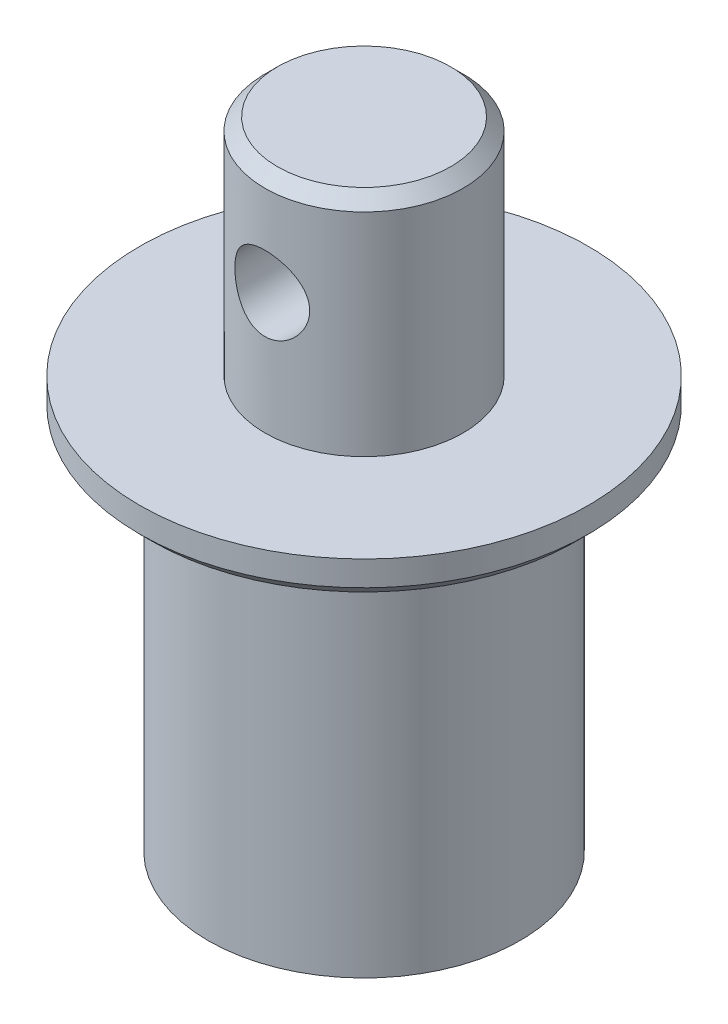
ISO-10303-21;
HEADER;
FILE_DESCRIPTION(('STEP AP214'),'2;1');
FILE_NAME('part.step','',(''),(''),'','','');
FILE_SCHEMA(('AUTOMOTIVE_DESIGN { 1 0 10303 214 1 1 1 1 }'));
ENDSEC;
DATA;
#1=APPLICATION_CONTEXT('core data for automotive mechanical design processes');
#2=APPLICATION_PROTOCOL_DEFINITION('international standard','automotive_design',2000,#1);
#3=PRODUCT_CONTEXT('',#1,'mechanical');
#4=PRODUCT('Part','Part','',(#3));
#5=PRODUCT_RELATED_PRODUCT_CATEGORY('part','',(#4));
#6=PRODUCT_DEFINITION_FORMATION('','',#4);
#7=PRODUCT_DEFINITION_CONTEXT('part definition',#1,'design');
#8=PRODUCT_DEFINITION('design','',#6,#7);
#9=PRODUCT_DEFINITION_SHAPE('','',#8);
#10=(LENGTH_UNIT() NAMED_UNIT(*) SI_UNIT(.MILLI.,.METRE.));
#11=(NAMED_UNIT(*) PLANE_ANGLE_UNIT() SI_UNIT($,.RADIAN.));
#12=(NAMED_UNIT(*) SI_UNIT($,.STERADIAN.) SOLID_ANGLE_UNIT());
#13=UNCERTAINTY_MEASURE_WITH_UNIT(LENGTH_MEASURE(1.E-05),#10,'distance_accuracy_value','');
#14=(GEOMETRIC_REPRESENTATION_CONTEXT(3) GLOBAL_UNCERTAINTY_ASSIGNED_CONTEXT((#13)) GLOBAL_UNIT_ASSIGNED_CONTEXT((#10,
#11,#12)) REPRESENTATION_CONTEXT('',''));
#15=CARTESIAN_POINT('',(0.,0.,0.));
#16=DIRECTION('',(0.,0.,1.));
#17=DIRECTION('',(1.,0.,0.));
#18=AXIS2_PLACEMENT_3D('',#15,#16,#17);
#19=CARTESIAN_POINT('',(0.,18.,0.));
#20=DIRECTION('',(0.,-1.,0.));
#21=DIRECTION('',(0.,0.,-1.));
#22=AXIS2_PLACEMENT_3D('',#19,#20,#21);
#23=CYLINDRICAL_SURFACE('',#22,7.95);
#24=CARTESIAN_POINT('',(0.,12.7,-7.95));
#25=CARTESIAN_POINT('',(-0.162397491346748,12.7000061558222,-7.95000463305476));
#26=CARTESIAN_POINT('',(-0.324753099848184,12.686772434708,-7.94498084128038));
#27=CARTESIAN_POINT('',(-0.644608276496746,12.6344046885734,-7.92544254710234));
#28=CARTESIAN_POINT('',(-0.802108607238702,12.5952747528614,-7.91092954315817));
#29=CARTESIAN_POINT('',(-1.10759384707584,12.4926982224202,-7.87396945860854));
#30=CARTESIAN_POINT('',(-1.25559660387506,12.4292988958457,-7.85153780728387));
#31=CARTESIAN_POINT('',(-1.53885384506537,12.2802252539554,-7.80097147100144));
#32=CARTESIAN_POINT('',(-1.67410485143574,12.1945448853293,-7.77283523668182));
#33=CARTESIAN_POINT('',(-1.93382546780257,11.9995011008524,-7.71241146666441));
#34=CARTESIAN_POINT('',(-2.05767538384719,11.8893495621118,-7.68000542519286));
#35=CARTESIAN_POINT('',(-2.28564512635348,11.6501633262448,-7.61527381268037));
#36=CARTESIAN_POINT('',(-2.38975880250598,11.5211227649516,-7.58294826981162));
#37=CARTESIAN_POINT('',(-2.57926636225751,11.2417374560993,-7.52065411531348));
#38=CARTESIAN_POINT('',(-2.6637805831916,11.0907618050901,-7.49082499932832));
#39=CARTESIAN_POINT('',(-2.80594178602416,10.7754371382371,-7.43874757327125));
#40=CARTESIAN_POINT('',(-2.86359965340992,10.611093572494,-7.41649619275682));
#41=CARTESIAN_POINT('',(-2.94795796885627,10.2808348690774,-7.38336190811873));
#42=CARTESIAN_POINT('',(-2.97584212262488,10.115266990026,-7.37204616258461));
#43=CARTESIAN_POINT('',(-3.00356228598173,9.7814451398545,-7.36079887492185));
#44=CARTESIAN_POINT('',(-3.00341006762254,9.61319232577162,-7.36086255474267));
#45=CARTESIAN_POINT('',(-2.97596618835097,9.28965599589298,-7.37199408836324));
#46=CARTESIAN_POINT('',(-2.950323119074,9.13420535263497,-7.38239348387374));
#47=CARTESIAN_POINT('',(-2.87535300460385,8.83000298266155,-7.41191277552078));
#48=CARTESIAN_POINT('',(-2.8260223465669,8.68125228161165,-7.43103400189338));
#49=CARTESIAN_POINT('',(-2.70418189216197,8.39133492929746,-7.47624078591974));
#50=CARTESIAN_POINT('',(-2.6312480533409,8.2503669739539,-7.50245218680417));
#51=CARTESIAN_POINT('',(-2.46456734066459,7.98219471048518,-7.55884475137268));
#52=CARTESIAN_POINT('',(-2.3708132173386,7.8549952194409,-7.58902729628462));
#53=CARTESIAN_POINT('',(-2.15763402761747,7.60885443691731,-7.65246921492573));
#54=CARTESIAN_POINT('',(-2.03689525756286,7.49106604037545,-7.68579812115875));
#55=CARTESIAN_POINT('',(-1.77699753283556,7.27706373431274,-7.75001160096118));
#56=CARTESIAN_POINT('',(-1.63783568074396,7.18085322479597,-7.78089578882361));
#57=CARTESIAN_POINT('',(-1.34207116187379,7.01144460931163,-7.8373678710877));
#58=CARTESIAN_POINT('',(-1.18522721144044,6.93863503487575,-7.86286415320891));
#59=CARTESIAN_POINT('',(-0.86031470200094,6.82081904211372,-7.90500692503182));
#60=CARTESIAN_POINT('',(-0.692251231753698,6.77580011265377,-7.92165739657785));
#61=CARTESIAN_POINT('',(-0.359369733398546,6.71707032438193,-7.94353018166807));
#62=CARTESIAN_POINT('',(-0.19486250407749,6.70180726332692,-7.94931845634064));
#63=CARTESIAN_POINT('',(0.134445660228267,6.69849692676496,-7.95056675753456));
#64=CARTESIAN_POINT('',(0.299246520773491,6.71044352644258,-7.94602910839152));
#65=CARTESIAN_POINT('',(0.617726140759181,6.76003703811891,-7.92750856979343));
#66=CARTESIAN_POINT('',(0.771587980773982,6.79666317138276,-7.91390105530444));
#67=CARTESIAN_POINT('',(1.07087124221814,6.89322789669408,-7.87898797802321));
#68=CARTESIAN_POINT('',(1.21629156356081,6.95316951937971,-7.85768141450416));
#69=CARTESIAN_POINT('',(1.49937620417867,7.09658093164373,-7.8086891601555));
#70=CARTESIAN_POINT('',(1.63668485220481,7.18069302598826,-7.78083372768987));
#71=CARTESIAN_POINT('',(1.89570132393103,7.36933296202654,-7.7218192041405));
#72=CARTESIAN_POINT('',(2.01740330922294,7.47386840734707,-7.6906588846264));
#73=CARTESIAN_POINT('',(2.24923419609776,7.70761385915857,-7.62618977395529));
#74=CARTESIAN_POINT('',(2.35826281750802,7.83791282891418,-7.59286232939511));
#75=CARTESIAN_POINT('',(2.55312943709526,8.1156069199928,-7.52957881379437));
#76=CARTESIAN_POINT('',(2.63896520992051,8.26300367990923,-7.49962306642862));
#77=CARTESIAN_POINT('',(2.78513438407435,8.57201209893149,-7.44658528316189));
#78=CARTESIAN_POINT('',(2.84534845350868,8.733686127761,-7.42353555585956));
#79=CARTESIAN_POINT('',(2.93729581964043,9.06599351023611,-7.38764350420071));
#80=CARTESIAN_POINT('',(2.96904704082561,9.23662115356447,-7.374794756358));
#81=CARTESIAN_POINT('',(3.00155503802499,9.57005302179686,-7.36161978142478));
#82=CARTESIAN_POINT('',(3.00419110375903,9.73264550820018,-7.36053436127972));
#83=CARTESIAN_POINT('',(2.98321973734044,10.0558276842463,-7.36905868877781));
#84=CARTESIAN_POINT('',(2.95961485946022,10.2164175672823,-7.37866739546335));
#85=CARTESIAN_POINT('',(2.88830176573362,10.5259293606051,-7.40686184253781));
#86=CARTESIAN_POINT('',(2.84137107510192,10.6750591479437,-7.42515720122094));
#87=CARTESIAN_POINT('',(2.72542723369112,10.963412785519,-7.46849099490141));
#88=CARTESIAN_POINT('',(2.65640846747208,11.1026341057172,-7.49353114436682));
#89=CARTESIAN_POINT('',(2.4940127469099,11.375226883347,-7.54918066261999));
#90=CARTESIAN_POINT('',(2.39954048534419,11.5078994030905,-7.58001455370614));
#91=CARTESIAN_POINT('',(2.19060617827199,11.7561080525092,-7.64301253026733));
#92=CARTESIAN_POINT('',(2.07613773887328,11.8716386790474,-7.67517703869663));
#93=CARTESIAN_POINT('',(1.82292686694646,12.0887750295145,-7.73934015838431));
#94=CARTESIAN_POINT('',(1.68319475235042,12.1892633965218,-7.7712320684291));
#95=CARTESIAN_POINT('',(1.38770505428977,12.365304905216,-7.82939530273651));
#96=CARTESIAN_POINT('',(1.23194587961074,12.4408555678737,-7.85566606811619));
#97=CARTESIAN_POINT('',(0.900729443719499,12.5673316594021,-7.90065816243918));
#98=CARTESIAN_POINT('',(0.72468257870646,12.6168806341044,-7.91895015266806));
#99=CARTESIAN_POINT('',(0.36573704474032,12.6832028472176,-7.94361537532247));
#100=CARTESIAN_POINT('',(0.182841976353428,12.6999930692113,-7.94999478368242));
#101=CARTESIAN_POINT('',(0.,12.7,-7.95));
#102=B_SPLINE_CURVE_WITH_KNOTS('',3,(#24,#25,#26,#27,#28,#29,#30,#31,#32,#33,#34,#35,#36,#37,
#38,#39,#40,#41,#42,#43,#44,#45,#46,#47,#48,#49,#50,#51,#52,#53,#54,#55,#56,#57,#58,#59,#60,#61,
#62,#63,#64,#65,#66,#67,#68,#69,#70,#71,#72,#73,#74,#75,#76,#77,#78,#79,#80,#81,#82,#83,#84,#85,
#86,#87,#88,#89,#90,#91,#92,#93,#94,#95,#96,#97,#98,#99,#100,#101),.UNSPECIFIED.,.T.,.F.,(4,2,2,
2,2,2,2,2,2,2,2,2,2,2,2,2,2,2,2,2,2,2,2,2,2,2,2,2,2,2,2,2,2,2,2,2,2,2,4),(0.,0.486517984474757,
0.972959160520783,1.45845770295972,1.94408828362444,2.44851024997547,2.95308914942897,
3.47718162143792,4.00106148167018,4.50323487057201,5.00519740487303,5.47667849204093,
5.94823151260985,6.42877607760176,6.90948822777715,7.42294833461538,7.93648929004924,
8.45816227693261,8.97960023906363,9.4730216283662,9.96633196092749,10.4403977118492,
10.9145251042877,11.4026484582173,11.8909538882842,12.4079529144854,12.9250015290952,
13.4444325927827,13.9635363143255,14.4489214843418,14.9342594114916,15.4044069203738,
15.8746740496895,16.36981560475,16.8651157749309,17.3876947690209,17.9103256964684,
18.4583764326353,19.0061429595389),.UNSPECIFIED.);
#103=CARTESIAN_POINT('',(0.,12.7,-7.95));
#104=VERTEX_POINT('',#103);
#105=EDGE_CURVE('E38',#104,#104,#102,.T.);
#106=ORIENTED_EDGE('',*,*,#105,.T.);
#107=EDGE_LOOP('',(#106));
#108=FACE_BOUND('',#107,.T.);
#109=CARTESIAN_POINT('',(3.,9.7,7.36223471508482));
#110=CARTESIAN_POINT('',(2.99998847638603,9.53818087912798,7.36224526269351));
#111=CARTESIAN_POINT('',(2.9868408533845,9.3762103722872,7.36763957602915));
#112=CARTESIAN_POINT('',(2.93479898105657,9.05725888996367,7.38851783959744));
#113=CARTESIAN_POINT('',(2.89590575612689,8.90027771621983,7.40400138838714));
#114=CARTESIAN_POINT('',(2.79402781177854,8.59586930724842,7.44304061076884));
#115=CARTESIAN_POINT('',(2.731101471071,8.44841992534473,7.46657670963436));
#116=CARTESIAN_POINT('',(2.58314510981222,8.16612081406447,7.51904250584225));
#117=CARTESIAN_POINT('',(2.49810836153358,8.03127493667398,7.54797384408236));
#118=CARTESIAN_POINT('',(2.30376153242717,7.77121232087998,7.60960064181843));
#119=CARTESIAN_POINT('',(2.19351841745457,7.64671904452181,7.64240778971228));
#120=CARTESIAN_POINT('',(1.95386685111475,7.41747705800545,7.70715883050975));
#121=CARTESIAN_POINT('',(1.82445425584252,7.31273262815022,7.73910253499114));
#122=CARTESIAN_POINT('',(1.5446329927432,7.12246295020474,7.79985728918744));
#123=CARTESIAN_POINT('',(1.3936537720354,7.03772592201908,7.82852214322748));
#124=CARTESIAN_POINT('',(1.07830992462711,6.89515458942065,7.87814508841391));
#125=CARTESIAN_POINT('',(0.913950027301735,6.83731082772747,7.89910588822244));
#126=CARTESIAN_POINT('',(0.584118525776006,6.75271083408455,7.93016590252776));
#127=CARTESIAN_POINT('',(0.419008191449069,6.72470854121812,7.9406990457691));
#128=CARTESIAN_POINT('',(0.0861182550130894,6.69659199426228,7.9512752587645));
#129=CARTESIAN_POINT('',(-0.0816604499755095,6.69646855740847,7.95132178261133));
#130=CARTESIAN_POINT('',(-0.406186165059413,6.7233915100908,7.94119442034515));
#131=CARTESIAN_POINT('',(-0.563064807507878,6.74907733331319,7.93153233504782));
#132=CARTESIAN_POINT('',(-0.870095460195534,6.82459864135385,7.90374636952053));
#133=CARTESIAN_POINT('',(-1.02024699260719,6.87443583868587,7.88562188924655));
#134=CARTESIAN_POINT('',(-1.31216781002694,6.9974680388243,7.84237373573117));
#135=CARTESIAN_POINT('',(-1.45378254871369,7.07099371538483,7.81715165701678));
#136=CARTESIAN_POINT('',(-1.72301698371786,7.23902153583117,7.76225605799518));
#137=CARTESIAN_POINT('',(-1.85063211474019,7.33353049219717,7.73258109302015));
#138=CARTESIAN_POINT('',(-2.09625291168491,7.54737826155229,7.66976135047149));
#139=CARTESIAN_POINT('',(-2.2132430127343,7.66785547278632,7.63651515908535));
#140=CARTESIAN_POINT('',(-2.42574456827632,7.92691204717986,7.57169953695764));
#141=CARTESIAN_POINT('',(-2.52125048739725,8.06549606102768,7.54013053993966));
#142=CARTESIAN_POINT('',(-2.69004722792075,8.36088829744311,7.48159976832992));
#143=CARTESIAN_POINT('',(-2.76278393320141,8.51803907720284,7.45475898596922));
#144=CARTESIAN_POINT('',(-2.880375100483,8.84363902404656,7.41012433225883));
#145=CARTESIAN_POINT('',(-2.92524531348823,9.0120817488069,7.39232535124068));
#146=CARTESIAN_POINT('',(-2.98350497294114,9.34543862821912,7.36899818161272));
#147=CARTESIAN_POINT('',(-2.99850974291805,9.51002612552786,7.36284132147711));
#148=CARTESIAN_POINT('',(-3.00127750176349,9.83944639008965,7.36171480133552));
#149=CARTESIAN_POINT('',(-2.98904742268387,10.0042790842612,7.36674229458981));
#150=CARTESIAN_POINT('',(-2.93915784101862,10.3211629550074,7.38677890427645));
#151=CARTESIAN_POINT('',(-2.90275536170076,10.4734469127311,7.40129408111521));
#152=CARTESIAN_POINT('',(-2.80714040331809,10.7696728223296,7.43808226609779));
#153=CARTESIAN_POINT('',(-2.74792321527995,10.9136130449902,7.46035687570344));
#154=CARTESIAN_POINT('',(-2.60584361626127,11.1951164240263,7.51118902933162));
#155=CARTESIAN_POINT('',(-2.5221722334124,11.3322330449096,7.53995219207521));
#156=CARTESIAN_POINT('',(-2.33441687648243,11.5910526702668,7.60017799915619));
#157=CARTESIAN_POINT('',(-2.2303253503514,11.7127499446626,7.63164163979143));
#158=CARTESIAN_POINT('',(-1.99676156560833,11.9453999274485,7.69616935064396));
#159=CARTESIAN_POINT('',(-1.86608723424952,12.055157597863,7.72920614910852));
#160=CARTESIAN_POINT('',(-1.5873664361605,12.2513337907439,7.79122096312534));
#161=CARTESIAN_POINT('',(-1.43931986006059,12.3377521662627,7.82019895312222));
#162=CARTESIAN_POINT('',(-1.13009967886562,12.4842477994431,7.87082025135715));
#163=CARTESIAN_POINT('',(-0.968969651016516,12.5444085640794,7.89248676165433));
#164=CARTESIAN_POINT('',(-0.637870931627841,12.6364273074365,7.9261118932038));
#165=CARTESIAN_POINT('',(-0.467906493780563,12.6682987760011,7.9380751412537));
#166=CARTESIAN_POINT('',(-0.134758318572021,12.7013659427001,7.95050234819133));
#167=CARTESIAN_POINT('',(0.0282347182748412,12.7042587720064,7.95160244842512));
#168=CARTESIAN_POINT('',(0.352286714056232,12.6836626905325,7.94384354853882));
#169=CARTESIAN_POINT('',(0.513345908784079,12.6601770297837,7.93498577530464));
#170=CARTESIAN_POINT('',(0.824872903926982,12.5886848977638,7.90859918182994));
#171=CARTESIAN_POINT('',(0.975504704927181,12.5413048913794,7.89129223621013));
#172=CARTESIAN_POINT('',(1.26668938334082,12.4239952510697,7.84981845145297));
#173=CARTESIAN_POINT('',(1.407240345928,12.3540613468895,7.82565031335174));
#174=CARTESIAN_POINT('',(1.68078304743255,12.1902710199168,7.77159770902848));
#175=CARTESIAN_POINT('',(1.81320405662409,12.0955282806332,7.74151478259925));
#176=CARTESIAN_POINT('',(2.06079145832988,11.886191784806,7.67932043381079));
#177=CARTESIAN_POINT('',(2.17595163342778,11.7715909071818,7.64720828641126));
#178=CARTESIAN_POINT('',(2.39209703979936,11.5185257698201,7.58246561904029));
#179=CARTESIAN_POINT('',(2.49199147751535,11.3791116040763,7.54989958951667));
#180=CARTESIAN_POINT('',(2.66701047282742,11.0843339824656,7.48987098387787));
#181=CARTESIAN_POINT('',(2.74213185351583,10.9289684843405,7.46240906251267));
#182=CARTESIAN_POINT('',(2.83572851156726,10.6832960070156,7.427133469645));
#183=CARTESIAN_POINT('',(2.86416654860317,10.5971118170317,7.41618073356408));
#184=CARTESIAN_POINT('',(2.91317517775546,10.4222468796589,7.39706747795765));
#185=CARTESIAN_POINT('',(2.93374932570495,10.3335672801464,7.38890569661591));
#186=CARTESIAN_POINT('',(2.96676758310502,10.1545045054933,7.37571079709818));
#187=CARTESIAN_POINT('',(2.97921437058769,10.0641219016166,7.37067664836809));
#188=CARTESIAN_POINT('',(2.99583331277785,9.88250884982683,7.36393584017285));
#189=CARTESIAN_POINT('',(3.00000650021022,9.79127850915807,7.36222876541712));
#190=CARTESIAN_POINT('',(3.,9.7,7.36223471508482));
#191=B_SPLINE_CURVE_WITH_KNOTS('',3,(#109,#110,#111,#112,#113,#114,#115,#116,#117,#118,#119,
#120,#121,#122,#123,#124,#125,#126,#127,#128,#129,#130,#131,#132,#133,#134,#135,#136,#137,#138,
#139,#140,#141,#142,#143,#144,#145,#146,#147,#148,#149,#150,#151,#152,#153,#154,#155,#156,#157,
#158,#159,#160,#161,#162,#163,#164,#165,#166,#167,#168,#169,#170,#171,#172,#173,#174,#175,#176,
#177,#178,#179,#180,#181,#182,#183,#184,#185,#186,#187,#188,#189,#190),.UNSPECIFIED.,.T.,.F.,(4,
2,2,2,2,2,2,2,2,2,2,2,2,2,2,2,2,2,2,2,2,2,2,2,2,2,2,2,2,2,2,2,2,2,2,2,2,2,2,2,4),(0.,
0.485113019094003,0.97020673709227,1.45412953481374,1.93819975263346,2.44443134249792,
2.95077252559746,3.47459178516768,3.99822669897873,4.49901899995725,4.99964634924538,
5.47519839146572,5.95078415883133,6.43331940839045,6.91601154864105,7.42726811632732,
7.93865625811923,8.46166485432304,8.98437756017793,9.47795435847515,9.97140554165079,
10.4410183842214,10.9107282072142,11.3981880218201,11.885828456347,12.4048427572537,
12.9238603258718,13.4412150191416,13.9583228773832,14.444955850278,14.9315288728514,
15.4059609368032,15.8804828804031,16.3750646117023,16.8698240672408,17.3911057262614,
17.9124542086976,18.1863439084664,18.4601096159644,18.7337850698281,19.0074263609033),.UNSPECIFIED.);
#192=CARTESIAN_POINT('',(3.,9.7,7.36223471508482));
#193=VERTEX_POINT('',#192);
#194=EDGE_CURVE('E71',#193,#193,#191,.T.);
#195=ORIENTED_EDGE('',*,*,#194,.T.);
#196=EDGE_LOOP('',(#195));
#197=FACE_BOUND('',#196,.T.);
#198=CARTESIAN_POINT('',(0.,17.,0.));
#199=DIRECTION('',(0.,1.,0.));
#200=DIRECTION('',(0.,0.,1.));
#201=AXIS2_PLACEMENT_3D('',#198,#199,#200);
#202=CIRCLE('',#201,7.95);
#203=CARTESIAN_POINT('',(0.,17.,7.95));
#204=VERTEX_POINT('',#203);
#205=EDGE_CURVE('E67',#204,#204,#202,.F.);
#206=ORIENTED_EDGE('',*,*,#205,.T.);
#207=EDGE_LOOP('',(#206));
#208=FACE_BOUND('',#207,.T.);
#209=CARTESIAN_POINT('',(0.,0.,0.));
#210=DIRECTION('',(0.,1.,0.));
#211=DIRECTION('',(0.,0.,1.));
#212=AXIS2_PLACEMENT_3D('',#209,#210,#211);
#213=CIRCLE('',#212,7.95);
#214=CARTESIAN_POINT('',(0.,0.,7.95));
#215=VERTEX_POINT('',#214);
#216=EDGE_CURVE('E61',#215,#215,#213,.T.);
#217=ORIENTED_EDGE('',*,*,#216,.T.);
#218=EDGE_LOOP('',(#217));
#219=FACE_BOUND('',#218,.T.);
#220=ADVANCED_FACE('F33',(#108,#197,#208,#219),#23,.T.);
#221=CARTESIAN_POINT('',(0.,18.,0.));
#222=DIRECTION('',(0.,1.,0.));
#223=DIRECTION('',(0.,0.,1.));
#224=AXIS2_PLACEMENT_3D('',#221,#222,#223);
#225=PLANE('',#224);
#226=CARTESIAN_POINT('',(0.,18.,0.));
#227=DIRECTION('',(0.,1.,0.));
#228=DIRECTION('',(0.,0.,1.));
#229=AXIS2_PLACEMENT_3D('',#226,#227,#228);
#230=CIRCLE('',#229,6.95);
#231=CARTESIAN_POINT('',(0.,18.,6.95));
#232=VERTEX_POINT('',#231);
#233=EDGE_CURVE('E64',#232,#232,#230,.T.);
#234=ORIENTED_EDGE('',*,*,#233,.T.);
#235=EDGE_LOOP('',(#234));
#236=FACE_BOUND('',#235,.T.);
#237=ADVANCED_FACE('F108',(#236),#225,.T.);
#238=CARTESIAN_POINT('',(0.,18.,0.));
#239=DIRECTION('',(0.,-1.,0.));
#240=DIRECTION('',(0.,0.,-1.));
#241=AXIS2_PLACEMENT_3D('',#238,#239,#240);
#242=CONICAL_SURFACE('',#241,6.95,0.785398163397444);
#243=ORIENTED_EDGE('',*,*,#205,.F.);
#244=EDGE_LOOP('',(#243));
#245=FACE_BOUND('',#244,.T.);
#246=ORIENTED_EDGE('',*,*,#233,.F.);
#247=EDGE_LOOP('',(#246));
#248=FACE_BOUND('',#247,.T.);
#249=ADVANCED_FACE('F106',(#245,#248),#242,.T.);
#250=CARTESIAN_POINT('',(0.,-3.,0.));
#251=DIRECTION('',(0.,1.,0.));
#252=DIRECTION('',(0.,0.,1.));
#253=AXIS2_PLACEMENT_3D('',#250,#251,#252);
#254=CYLINDRICAL_SURFACE('',#253,18.);
#255=CARTESIAN_POINT('',(0.,-2.,0.));
#256=DIRECTION('',(0.,1.,0.));
#257=DIRECTION('',(0.,0.,1.));
#258=AXIS2_PLACEMENT_3D('',#255,#256,#257);
#259=CIRCLE('',#258,18.);
#260=CARTESIAN_POINT('',(0.,-2.,18.));
#261=VERTEX_POINT('',#260);
#262=EDGE_CURVE('E52',#261,#261,#259,.T.);
#263=ORIENTED_EDGE('',*,*,#262,.T.);
#264=EDGE_LOOP('',(#263));
#265=FACE_BOUND('',#264,.T.);
#266=CARTESIAN_POINT('',(0.,0.,0.));
#267=DIRECTION('',(0.,1.,0.));
#268=DIRECTION('',(0.,0.,1.));
#269=AXIS2_PLACEMENT_3D('',#266,#267,#268);
#270=CIRCLE('',#269,18.);
#271=CARTESIAN_POINT('',(0.,0.,18.));
#272=VERTEX_POINT('',#271);
#273=EDGE_CURVE('E58',#272,#272,#270,.T.);
#274=ORIENTED_EDGE('',*,*,#273,.F.);
#275=EDGE_LOOP('',(#274));
#276=FACE_BOUND('',#275,.T.);
#277=ADVANCED_FACE('F100',(#265,#276),#254,.T.);
#278=CARTESIAN_POINT('',(0.,-3.,0.));
#279=DIRECTION('',(0.,1.,0.));
#280=DIRECTION('',(0.,0.,1.));
#281=AXIS2_PLACEMENT_3D('',#278,#279,#280);
#282=PLANE('',#281);
#283=CARTESIAN_POINT('',(0.,-3.,0.));
#284=DIRECTION('',(0.,-1.,0.));
#285=DIRECTION('',(0.,0.,-1.));
#286=AXIS2_PLACEMENT_3D('',#283,#284,#285);
#287=CIRCLE('',#286,12.5);
#288=CARTESIAN_POINT('',(0.,-3.,-12.5));
#289=VERTEX_POINT('',#288);
#290=EDGE_CURVE('E10',#289,#289,#287,.T.);
#291=ORIENTED_EDGE('',*,*,#290,.F.);
#292=EDGE_LOOP('',(#291));
#293=FACE_BOUND('',#292,.T.);
#294=CARTESIAN_POINT('',(0.,-3.,0.));
#295=DIRECTION('',(0.,1.,0.));
#296=DIRECTION('',(0.,0.,1.));
#297=AXIS2_PLACEMENT_3D('',#294,#295,#296);
#298=CIRCLE('',#297,17.);
#299=CARTESIAN_POINT('',(0.,-3.,17.));
#300=VERTEX_POINT('',#299);
#301=EDGE_CURVE('E47',#300,#300,#298,.F.);
#302=ORIENTED_EDGE('',*,*,#301,.T.);
#303=EDGE_LOOP('',(#302));
#304=FACE_BOUND('',#303,.T.);
#305=ADVANCED_FACE('F96',(#293,#304),#282,.F.);
#306=CARTESIAN_POINT('',(0.,0.,0.));
#307=DIRECTION('',(0.,1.,0.));
#308=DIRECTION('',(0.,0.,1.));
#309=AXIS2_PLACEMENT_3D('',#306,#307,#308);
#310=PLANE('',#309);
#311=ORIENTED_EDGE('',*,*,#216,.F.);
#312=EDGE_LOOP('',(#311));
#313=FACE_BOUND('',#312,.T.);
#314=ORIENTED_EDGE('',*,*,#273,.T.);
#315=EDGE_LOOP('',(#314));
#316=FACE_BOUND('',#315,.T.);
#317=ADVANCED_FACE('F99',(#313,#316),#310,.T.);
#318=CARTESIAN_POINT('',(0.,-2.,0.));
#319=DIRECTION('',(0.,1.,0.));
#320=DIRECTION('',(0.,0.,1.));
#321=AXIS2_PLACEMENT_3D('',#318,#319,#320);
#322=CONICAL_SURFACE('',#321,18.,0.78539816339745);
#323=ORIENTED_EDGE('',*,*,#301,.F.);
#324=EDGE_LOOP('',(#323));
#325=FACE_BOUND('',#324,.T.);
#326=ORIENTED_EDGE('',*,*,#262,.F.);
#327=EDGE_LOOP('',(#326));
#328=FACE_BOUND('',#327,.T.);
#329=ADVANCED_FACE('F36',(#325,#328),#322,.T.);
#330=CARTESIAN_POINT('',(0.,-33.,0.));
#331=DIRECTION('',(0.,1.,0.));
#332=DIRECTION('',(0.,0.,1.));
#333=AXIS2_PLACEMENT_3D('',#330,#331,#332);
#334=CYLINDRICAL_SURFACE('',#333,12.5);
#335=CARTESIAN_POINT('',(0.,-33.,0.));
#336=DIRECTION('',(0.,-1.,0.));
#337=DIRECTION('',(0.,0.,-1.));
#338=AXIS2_PLACEMENT_3D('',#335,#336,#337);
#339=CIRCLE('',#338,12.5);
#340=CARTESIAN_POINT('',(0.,-33.,-12.5));
#341=VERTEX_POINT('',#340);
#342=EDGE_CURVE('E56',#341,#341,#339,.T.);
#343=ORIENTED_EDGE('',*,*,#342,.F.);
#344=EDGE_LOOP('',(#343));
#345=FACE_BOUND('',#344,.T.);
#346=ORIENTED_EDGE('',*,*,#290,.T.);
#347=EDGE_LOOP('',(#346));
#348=FACE_BOUND('',#347,.T.);
#349=ADVANCED_FACE('F91',(#345,#348),#334,.T.);
#350=CARTESIAN_POINT('',(0.,-33.,0.));
#351=DIRECTION('',(0.,-1.,0.));
#352=DIRECTION('',(0.,0.,-1.));
#353=AXIS2_PLACEMENT_3D('',#350,#351,#352);
#354=PLANE('',#353);
#355=CARTESIAN_POINT('',(0.,-33.,0.));
#356=DIRECTION('',(0.,-1.,0.));
#357=DIRECTION('',(0.,0.,-1.));
#358=AXIS2_PLACEMENT_3D('',#355,#356,#357);
#359=CIRCLE('',#358,7.95);
#360=CARTESIAN_POINT('',(0.,-33.,-7.95));
#361=VERTEX_POINT('',#360);
#362=EDGE_CURVE('E76',#361,#361,#359,.T.);
#363=ORIENTED_EDGE('',*,*,#362,.F.);
#364=EDGE_LOOP('',(#363));
#365=FACE_BOUND('',#364,.T.);
#366=ORIENTED_EDGE('',*,*,#342,.T.);
#367=EDGE_LOOP('',(#366));
#368=FACE_BOUND('',#367,.T.);
#369=ADVANCED_FACE('F85',(#365,#368),#354,.T.);
#370=CARTESIAN_POINT('',(0.,9.7,-18.));
#371=DIRECTION('',(0.,0.,1.));
#372=DIRECTION('',(1.,0.,0.));
#373=AXIS2_PLACEMENT_3D('',#370,#371,#372);
#374=CYLINDRICAL_SURFACE('',#373,3.);
#375=ORIENTED_EDGE('',*,*,#194,.F.);
#376=EDGE_LOOP('',(#375));
#377=FACE_BOUND('',#376,.T.);
#378=ORIENTED_EDGE('',*,*,#105,.F.);
#379=EDGE_LOOP('',(#378));
#380=FACE_BOUND('',#379,.T.);
#381=ADVANCED_FACE('F79',(#377,#380),#374,.F.);
#382=CARTESIAN_POINT('',(0.,-55.4859956417322,0.));
#383=DIRECTION('',(0.,1.,0.));
#384=DIRECTION('',(0.,0.,1.));
#385=AXIS2_PLACEMENT_3D('',#382,#383,#384);
#386=CYLINDRICAL_SURFACE('',#385,7.95);
#387=CARTESIAN_POINT('',(0.,-13.,0.));
#388=DIRECTION('',(0.,-1.,0.));
#389=DIRECTION('',(0.,0.,-1.));
#390=AXIS2_PLACEMENT_3D('',#387,#388,#389);
#391=CIRCLE('',#390,7.95);
#392=CARTESIAN_POINT('',(0.,-13.,-7.95));
#393=VERTEX_POINT('',#392);
#394=EDGE_CURVE('E176',#393,#393,#391,.T.);
#395=ORIENTED_EDGE('',*,*,#394,.F.);
#396=EDGE_LOOP('',(#395));
#397=FACE_BOUND('',#396,.T.);
#398=ORIENTED_EDGE('',*,*,#362,.T.);
#399=EDGE_LOOP('',(#398));
#400=FACE_BOUND('',#399,.T.);
#401=ADVANCED_FACE('F84',(#397,#400),#386,.F.);
#402=CARTESIAN_POINT('',(0.,-13.,0.));
#403=DIRECTION('',(0.,-1.,0.));
#404=DIRECTION('',(0.,0.,-1.));
#405=AXIS2_PLACEMENT_3D('',#402,#403,#404);
#406=PLANE('',#405);
#407=ORIENTED_EDGE('',*,*,#394,.T.);
#408=EDGE_LOOP('',(#407));
#409=FACE_BOUND('',#408,.T.);
#410=ADVANCED_FACE('F162',(#409),#406,.T.);
#411=CLOSED_SHELL('',(#220,#237,#249,#277,#305,#317,#329,#349,#369,#381,#401,#410));
#412=MANIFOLD_SOLID_BREP('B2',#411);
#413=ADVANCED_BREP_SHAPE_REPRESENTATION('',(#18,#412),#14);
#414=SHAPE_DEFINITION_REPRESENTATION(#9,#413);
ENDSEC;
END-ISO-10303-21;
